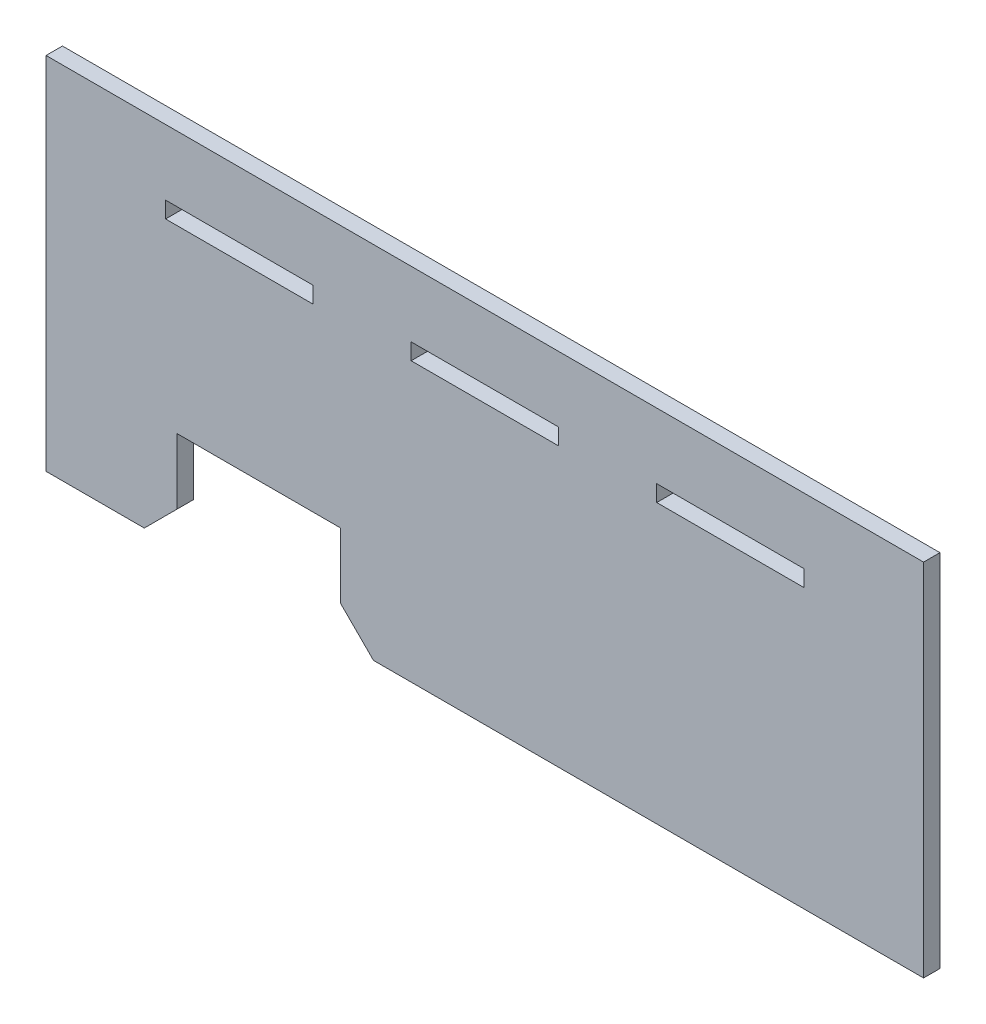
ISO-10303-21;
HEADER;
FILE_DESCRIPTION(('STEP AP214'),'2;1');
FILE_NAME('part.step','',(''),(''),'','','');
FILE_SCHEMA(('AUTOMOTIVE_DESIGN { 1 0 10303 214 1 1 1 1 }'));
ENDSEC;
DATA;
#1=APPLICATION_CONTEXT('core data for automotive mechanical design processes');
#2=APPLICATION_PROTOCOL_DEFINITION('international standard','automotive_design',2000,#1);
#3=PRODUCT_CONTEXT('',#1,'mechanical');
#4=PRODUCT('Part','Part','',(#3));
#5=PRODUCT_RELATED_PRODUCT_CATEGORY('part','',(#4));
#6=PRODUCT_DEFINITION_FORMATION('','',#4);
#7=PRODUCT_DEFINITION_CONTEXT('part definition',#1,'design');
#8=PRODUCT_DEFINITION('design','',#6,#7);
#9=PRODUCT_DEFINITION_SHAPE('','',#8);
#10=(LENGTH_UNIT() NAMED_UNIT(*) SI_UNIT(.MILLI.,.METRE.));
#11=(NAMED_UNIT(*) PLANE_ANGLE_UNIT() SI_UNIT($,.RADIAN.));
#12=(NAMED_UNIT(*) SI_UNIT($,.STERADIAN.) SOLID_ANGLE_UNIT());
#13=UNCERTAINTY_MEASURE_WITH_UNIT(LENGTH_MEASURE(1.E-05),#10,'distance_accuracy_value','');
#14=(GEOMETRIC_REPRESENTATION_CONTEXT(3) GLOBAL_UNCERTAINTY_ASSIGNED_CONTEXT((#13)) GLOBAL_UNIT_ASSIGNED_CONTEXT((#10,
#11,#12)) REPRESENTATION_CONTEXT('',''));
#15=CARTESIAN_POINT('',(0.,0.,0.));
#16=DIRECTION('',(0.,0.,1.));
#17=DIRECTION('',(1.,0.,0.));
#18=AXIS2_PLACEMENT_3D('',#15,#16,#17);
#19=CARTESIAN_POINT('',(0.,0.,10.));
#20=DIRECTION('',(0.,0.,1.));
#21=DIRECTION('',(1.,0.,0.));
#22=AXIS2_PLACEMENT_3D('',#19,#20,#21);
#23=PLANE('',#22);
#24=DIRECTION('',(0.,1.,0.));
#25=VECTOR('',#24,1.);
#26=CARTESIAN_POINT('',(313.,180.,10.));
#27=LINE('',#26,#25);
#28=CARTESIAN_POINT('',(313.,170.,10.));
#29=VERTEX_POINT('',#28);
#30=CARTESIAN_POINT('',(313.,180.,10.));
#31=VERTEX_POINT('',#30);
#32=EDGE_CURVE('E226',#29,#31,#27,.T.);
#33=ORIENTED_EDGE('',*,*,#32,.F.);
#34=DIRECTION('',(1.,0.,0.));
#35=VECTOR('',#34,1.);
#36=CARTESIAN_POINT('',(223.,170.,10.));
#37=LINE('',#36,#35);
#38=CARTESIAN_POINT('',(223.,170.,10.));
#39=VERTEX_POINT('',#38);
#40=EDGE_CURVE('E224',#39,#29,#37,.T.);
#41=ORIENTED_EDGE('',*,*,#40,.F.);
#42=DIRECTION('',(0.,-1.,0.));
#43=VECTOR('',#42,1.);
#44=CARTESIAN_POINT('',(223.,180.,10.));
#45=LINE('',#44,#43);
#46=CARTESIAN_POINT('',(223.,180.,10.));
#47=VERTEX_POINT('',#46);
#48=EDGE_CURVE('E232',#47,#39,#45,.T.);
#49=ORIENTED_EDGE('',*,*,#48,.F.);
#50=DIRECTION('',(-1.,0.,0.));
#51=VECTOR('',#50,1.);
#52=CARTESIAN_POINT('',(313.,180.,10.));
#53=LINE('',#52,#51);
#54=EDGE_CURVE('E229',#31,#47,#53,.T.);
#55=ORIENTED_EDGE('',*,*,#54,.F.);
#56=EDGE_LOOP('',(#33,#41,#49,#55));
#57=FACE_BOUND('',#56,.T.);
#58=DIRECTION('',(1.,0.,0.));
#59=VECTOR('',#58,1.);
#60=CARTESIAN_POINT('',(0.,0.,10.));
#61=LINE('',#60,#59);
#62=CARTESIAN_POINT('',(0.,0.,10.));
#63=VERTEX_POINT('',#62);
#64=CARTESIAN_POINT('',(59.9999999999999,0.,10.));
#65=VERTEX_POINT('',#64);
#66=EDGE_CURVE('E286',#63,#65,#61,.T.);
#67=ORIENTED_EDGE('',*,*,#66,.T.);
#68=DIRECTION('',(-0.707106781186549,-0.707106781186546,0.));
#69=VECTOR('',#68,1.);
#70=CARTESIAN_POINT('',(29.9999999999998,-29.9999999999999,10.));
#71=LINE('',#70,#69);
#72=CARTESIAN_POINT('',(80.,20.,10.));
#73=VERTEX_POINT('',#72);
#74=EDGE_CURVE('E347',#65,#73,#71,.F.);
#75=ORIENTED_EDGE('',*,*,#74,.T.);
#76=DIRECTION('',(0.,1.,0.));
#77=VECTOR('',#76,1.);
#78=CARTESIAN_POINT('',(80.,0.,10.));
#79=LINE('',#78,#77);
#80=CARTESIAN_POINT('',(80.,60.,10.));
#81=VERTEX_POINT('',#80);
#82=EDGE_CURVE('E289',#73,#81,#79,.T.);
#83=ORIENTED_EDGE('',*,*,#82,.T.);
#84=DIRECTION('',(1.,0.,0.));
#85=VECTOR('',#84,1.);
#86=CARTESIAN_POINT('',(80.,60.,10.));
#87=LINE('',#86,#85);
#88=CARTESIAN_POINT('',(180.,60.,10.));
#89=VERTEX_POINT('',#88);
#90=EDGE_CURVE('E292',#81,#89,#87,.T.);
#91=ORIENTED_EDGE('',*,*,#90,.T.);
#92=DIRECTION('',(0.,-1.,0.));
#93=VECTOR('',#92,1.);
#94=CARTESIAN_POINT('',(180.,60.,10.));
#95=LINE('',#94,#93);
#96=CARTESIAN_POINT('',(180.,20.0000000000001,10.));
#97=VERTEX_POINT('',#96);
#98=EDGE_CURVE('E294',#89,#97,#95,.T.);
#99=ORIENTED_EDGE('',*,*,#98,.T.);
#100=DIRECTION('',(-0.707106781186546,0.70710678118655,0.));
#101=VECTOR('',#100,1.);
#102=CARTESIAN_POINT('',(100.000000000001,100.,10.));
#103=LINE('',#102,#101);
#104=CARTESIAN_POINT('',(200.,0.,10.));
#105=VERTEX_POINT('',#104);
#106=EDGE_CURVE('E48',#97,#105,#103,.F.);
#107=ORIENTED_EDGE('',*,*,#106,.T.);
#108=DIRECTION('',(1.,0.,0.));
#109=VECTOR('',#108,1.);
#110=CARTESIAN_POINT('',(180.,0.,10.));
#111=LINE('',#110,#109);
#112=CARTESIAN_POINT('',(536.,0.,10.));
#113=VERTEX_POINT('',#112);
#114=EDGE_CURVE('E296',#105,#113,#111,.T.);
#115=ORIENTED_EDGE('',*,*,#114,.T.);
#116=DIRECTION('',(0.,1.,0.));
#117=VECTOR('',#116,1.);
#118=CARTESIAN_POINT('',(536.,0.,10.));
#119=LINE('',#118,#117);
#120=CARTESIAN_POINT('',(536.,220.,10.));
#121=VERTEX_POINT('',#120);
#122=EDGE_CURVE('E298',#113,#121,#119,.T.);
#123=ORIENTED_EDGE('',*,*,#122,.T.);
#124=DIRECTION('',(-1.,0.,0.));
#125=VECTOR('',#124,1.);
#126=CARTESIAN_POINT('',(0.,220.,10.));
#127=LINE('',#126,#125);
#128=CARTESIAN_POINT('',(0.,220.,10.));
#129=VERTEX_POINT('',#128);
#130=EDGE_CURVE('E300',#121,#129,#127,.T.);
#131=ORIENTED_EDGE('',*,*,#130,.T.);
#132=DIRECTION('',(0.,-1.,0.));
#133=VECTOR('',#132,1.);
#134=CARTESIAN_POINT('',(0.,0.,10.));
#135=LINE('',#134,#133);
#136=EDGE_CURVE('E302',#129,#63,#135,.T.);
#137=ORIENTED_EDGE('',*,*,#136,.T.);
#138=EDGE_LOOP('',(#67,#75,#83,#91,#99,#107,#115,#123,#131,#137));
#139=FACE_BOUND('',#138,.T.);
#140=DIRECTION('',(0.,-1.,0.));
#141=VECTOR('',#140,1.);
#142=CARTESIAN_POINT('',(73.,180.,10.));
#143=LINE('',#142,#141);
#144=CARTESIAN_POINT('',(73.,180.,10.));
#145=VERTEX_POINT('',#144);
#146=CARTESIAN_POINT('',(73.,170.,10.));
#147=VERTEX_POINT('',#146);
#148=EDGE_CURVE('E257',#145,#147,#143,.T.);
#149=ORIENTED_EDGE('',*,*,#148,.F.);
#150=DIRECTION('',(-1.,0.,0.));
#151=VECTOR('',#150,1.);
#152=CARTESIAN_POINT('',(163.,180.,10.));
#153=LINE('',#152,#151);
#154=CARTESIAN_POINT('',(163.,180.,10.));
#155=VERTEX_POINT('',#154);
#156=EDGE_CURVE('E255',#155,#145,#153,.T.);
#157=ORIENTED_EDGE('',*,*,#156,.F.);
#158=DIRECTION('',(0.,1.,0.));
#159=VECTOR('',#158,1.);
#160=CARTESIAN_POINT('',(163.,180.,10.));
#161=LINE('',#160,#159);
#162=CARTESIAN_POINT('',(163.,170.,10.));
#163=VERTEX_POINT('',#162);
#164=EDGE_CURVE('E263',#163,#155,#161,.T.);
#165=ORIENTED_EDGE('',*,*,#164,.F.);
#166=DIRECTION('',(1.,0.,0.));
#167=VECTOR('',#166,1.);
#168=CARTESIAN_POINT('',(163.,170.,10.));
#169=LINE('',#168,#167);
#170=EDGE_CURVE('E260',#147,#163,#169,.T.);
#171=ORIENTED_EDGE('',*,*,#170,.F.);
#172=EDGE_LOOP('',(#149,#157,#165,#171));
#173=FACE_BOUND('',#172,.T.);
#174=DIRECTION('',(0.,1.,0.));
#175=VECTOR('',#174,1.);
#176=CARTESIAN_POINT('',(463.,180.,10.));
#177=LINE('',#176,#175);
#178=CARTESIAN_POINT('',(463.,170.,10.));
#179=VERTEX_POINT('',#178);
#180=CARTESIAN_POINT('',(463.,180.,10.));
#181=VERTEX_POINT('',#180);
#182=EDGE_CURVE('E193',#179,#181,#177,.T.);
#183=ORIENTED_EDGE('',*,*,#182,.F.);
#184=DIRECTION('',(1.,0.,0.));
#185=VECTOR('',#184,1.);
#186=CARTESIAN_POINT('',(463.,170.,10.));
#187=LINE('',#186,#185);
#188=CARTESIAN_POINT('',(373.,170.,10.));
#189=VERTEX_POINT('',#188);
#190=EDGE_CURVE('E183',#189,#179,#187,.T.);
#191=ORIENTED_EDGE('',*,*,#190,.F.);
#192=DIRECTION('',(0.,-1.,0.));
#193=VECTOR('',#192,1.);
#194=CARTESIAN_POINT('',(373.,180.,10.));
#195=LINE('',#194,#193);
#196=CARTESIAN_POINT('',(373.,180.,10.));
#197=VERTEX_POINT('',#196);
#198=EDGE_CURVE('E208',#197,#189,#195,.T.);
#199=ORIENTED_EDGE('',*,*,#198,.F.);
#200=DIRECTION('',(-1.,0.,0.));
#201=VECTOR('',#200,1.);
#202=CARTESIAN_POINT('',(373.,180.,10.));
#203=LINE('',#202,#201);
#204=EDGE_CURVE('E206',#181,#197,#203,.T.);
#205=ORIENTED_EDGE('',*,*,#204,.F.);
#206=EDGE_LOOP('',(#183,#191,#199,#205));
#207=FACE_BOUND('',#206,.T.);
#208=ADVANCED_FACE('F33',(#57,#139,#173,#207),#23,.T.);
#209=CARTESIAN_POINT('',(0.,0.,0.));
#210=DIRECTION('',(0.,0.,1.));
#211=DIRECTION('',(1.,0.,0.));
#212=AXIS2_PLACEMENT_3D('',#209,#210,#211);
#213=PLANE('',#212);
#214=DIRECTION('',(1.,0.,0.));
#215=VECTOR('',#214,1.);
#216=CARTESIAN_POINT('',(223.,170.,0.));
#217=LINE('',#216,#215);
#218=CARTESIAN_POINT('',(223.,170.,0.));
#219=VERTEX_POINT('',#218);
#220=CARTESIAN_POINT('',(313.,170.,0.));
#221=VERTEX_POINT('',#220);
#222=EDGE_CURVE('E201',#219,#221,#217,.T.);
#223=ORIENTED_EDGE('',*,*,#222,.T.);
#224=DIRECTION('',(0.,1.,0.));
#225=VECTOR('',#224,1.);
#226=CARTESIAN_POINT('',(313.,180.,0.));
#227=LINE('',#226,#225);
#228=CARTESIAN_POINT('',(313.,180.,0.));
#229=VERTEX_POINT('',#228);
#230=EDGE_CURVE('E237',#221,#229,#227,.T.);
#231=ORIENTED_EDGE('',*,*,#230,.T.);
#232=DIRECTION('',(-1.,0.,0.));
#233=VECTOR('',#232,1.);
#234=CARTESIAN_POINT('',(313.,180.,0.));
#235=LINE('',#234,#233);
#236=CARTESIAN_POINT('',(223.,180.,0.));
#237=VERTEX_POINT('',#236);
#238=EDGE_CURVE('E240',#229,#237,#235,.T.);
#239=ORIENTED_EDGE('',*,*,#238,.T.);
#240=DIRECTION('',(0.,-1.,0.));
#241=VECTOR('',#240,1.);
#242=CARTESIAN_POINT('',(223.,180.,0.));
#243=LINE('',#242,#241);
#244=EDGE_CURVE('E227',#237,#219,#243,.T.);
#245=ORIENTED_EDGE('',*,*,#244,.T.);
#246=EDGE_LOOP('',(#223,#231,#239,#245));
#247=FACE_BOUND('',#246,.T.);
#248=DIRECTION('',(0.,1.,0.));
#249=VECTOR('',#248,1.);
#250=CARTESIAN_POINT('',(80.,0.,0.));
#251=LINE('',#250,#249);
#252=CARTESIAN_POINT('',(80.,20.,0.));
#253=VERTEX_POINT('',#252);
#254=CARTESIAN_POINT('',(80.,60.,0.));
#255=VERTEX_POINT('',#254);
#256=EDGE_CURVE('E307',#253,#255,#251,.T.);
#257=ORIENTED_EDGE('',*,*,#256,.F.);
#258=DIRECTION('',(0.707106781186549,0.707106781186546,0.));
#259=VECTOR('',#258,1.);
#260=CARTESIAN_POINT('',(80.,20.,0.));
#261=LINE('',#260,#259);
#262=CARTESIAN_POINT('',(59.9999999999999,0.,0.));
#263=VERTEX_POINT('',#262);
#264=EDGE_CURVE('E342',#253,#263,#261,.F.);
#265=ORIENTED_EDGE('',*,*,#264,.T.);
#266=DIRECTION('',(1.,0.,0.));
#267=VECTOR('',#266,1.);
#268=CARTESIAN_POINT('',(0.,0.,0.));
#269=LINE('',#268,#267);
#270=CARTESIAN_POINT('',(0.,0.,0.));
#271=VERTEX_POINT('',#270);
#272=EDGE_CURVE('E285',#271,#263,#269,.T.);
#273=ORIENTED_EDGE('',*,*,#272,.F.);
#274=DIRECTION('',(0.,-1.,0.));
#275=VECTOR('',#274,1.);
#276=CARTESIAN_POINT('',(0.,0.,0.));
#277=LINE('',#276,#275);
#278=CARTESIAN_POINT('',(0.,220.,0.));
#279=VERTEX_POINT('',#278);
#280=EDGE_CURVE('E290',#279,#271,#277,.T.);
#281=ORIENTED_EDGE('',*,*,#280,.F.);
#282=DIRECTION('',(-1.,0.,0.));
#283=VECTOR('',#282,1.);
#284=CARTESIAN_POINT('',(0.,220.,0.));
#285=LINE('',#284,#283);
#286=CARTESIAN_POINT('',(536.,220.,0.));
#287=VERTEX_POINT('',#286);
#288=EDGE_CURVE('E317',#287,#279,#285,.T.);
#289=ORIENTED_EDGE('',*,*,#288,.F.);
#290=DIRECTION('',(0.,1.,0.));
#291=VECTOR('',#290,1.);
#292=CARTESIAN_POINT('',(536.,0.,0.));
#293=LINE('',#292,#291);
#294=CARTESIAN_POINT('',(536.,0.,0.));
#295=VERTEX_POINT('',#294);
#296=EDGE_CURVE('E315',#295,#287,#293,.T.);
#297=ORIENTED_EDGE('',*,*,#296,.F.);
#298=DIRECTION('',(1.,0.,0.));
#299=VECTOR('',#298,1.);
#300=CARTESIAN_POINT('',(435.999999999999,0.,0.));
#301=LINE('',#300,#299);
#302=CARTESIAN_POINT('',(200.,0.,0.));
#303=VERTEX_POINT('',#302);
#304=EDGE_CURVE('E313',#303,#295,#301,.T.);
#305=ORIENTED_EDGE('',*,*,#304,.F.);
#306=DIRECTION('',(0.707106781186546,-0.70710678118655,0.));
#307=VECTOR('',#306,1.);
#308=CARTESIAN_POINT('',(200.,0.,0.));
#309=LINE('',#308,#307);
#310=CARTESIAN_POINT('',(180.,20.0000000000001,0.));
#311=VERTEX_POINT('',#310);
#312=EDGE_CURVE('E340',#303,#311,#309,.F.);
#313=ORIENTED_EDGE('',*,*,#312,.T.);
#314=DIRECTION('',(0.,-1.,0.));
#315=VECTOR('',#314,1.);
#316=CARTESIAN_POINT('',(180.,60.,0.));
#317=LINE('',#316,#315);
#318=CARTESIAN_POINT('',(180.,60.,0.));
#319=VERTEX_POINT('',#318);
#320=EDGE_CURVE('E311',#319,#311,#317,.T.);
#321=ORIENTED_EDGE('',*,*,#320,.F.);
#322=DIRECTION('',(1.,0.,0.));
#323=VECTOR('',#322,1.);
#324=CARTESIAN_POINT('',(80.,60.,0.));
#325=LINE('',#324,#323);
#326=EDGE_CURVE('E309',#255,#319,#325,.T.);
#327=ORIENTED_EDGE('',*,*,#326,.F.);
#328=EDGE_LOOP('',(#257,#265,#273,#281,#289,#297,#305,#313,#321,#327));
#329=FACE_BOUND('',#328,.T.);
#330=DIRECTION('',(-1.,0.,0.));
#331=VECTOR('',#330,1.);
#332=CARTESIAN_POINT('',(163.,180.,0.));
#333=LINE('',#332,#331);
#334=CARTESIAN_POINT('',(163.,180.,0.));
#335=VERTEX_POINT('',#334);
#336=CARTESIAN_POINT('',(73.,180.,0.));
#337=VERTEX_POINT('',#336);
#338=EDGE_CURVE('E254',#335,#337,#333,.T.);
#339=ORIENTED_EDGE('',*,*,#338,.T.);
#340=DIRECTION('',(0.,-1.,0.));
#341=VECTOR('',#340,1.);
#342=CARTESIAN_POINT('',(73.,180.,0.));
#343=LINE('',#342,#341);
#344=CARTESIAN_POINT('',(73.,170.,0.));
#345=VERTEX_POINT('',#344);
#346=EDGE_CURVE('E268',#337,#345,#343,.T.);
#347=ORIENTED_EDGE('',*,*,#346,.T.);
#348=DIRECTION('',(1.,0.,0.));
#349=VECTOR('',#348,1.);
#350=CARTESIAN_POINT('',(163.,170.,0.));
#351=LINE('',#350,#349);
#352=CARTESIAN_POINT('',(163.,170.,0.));
#353=VERTEX_POINT('',#352);
#354=EDGE_CURVE('E271',#345,#353,#351,.T.);
#355=ORIENTED_EDGE('',*,*,#354,.T.);
#356=DIRECTION('',(0.,1.,0.));
#357=VECTOR('',#356,1.);
#358=CARTESIAN_POINT('',(163.,180.,0.));
#359=LINE('',#358,#357);
#360=EDGE_CURVE('E258',#353,#335,#359,.T.);
#361=ORIENTED_EDGE('',*,*,#360,.T.);
#362=EDGE_LOOP('',(#339,#347,#355,#361));
#363=FACE_BOUND('',#362,.T.);
#364=DIRECTION('',(1.,0.,0.));
#365=VECTOR('',#364,1.);
#366=CARTESIAN_POINT('',(463.,170.,0.));
#367=LINE('',#366,#365);
#368=CARTESIAN_POINT('',(373.,170.,0.));
#369=VERTEX_POINT('',#368);
#370=CARTESIAN_POINT('',(463.,170.,0.));
#371=VERTEX_POINT('',#370);
#372=EDGE_CURVE('E212',#369,#371,#367,.T.);
#373=ORIENTED_EDGE('',*,*,#372,.T.);
#374=DIRECTION('',(0.,1.,0.));
#375=VECTOR('',#374,1.);
#376=CARTESIAN_POINT('',(463.,180.,0.));
#377=LINE('',#376,#375);
#378=CARTESIAN_POINT('',(463.,180.,0.));
#379=VERTEX_POINT('',#378);
#380=EDGE_CURVE('E200',#371,#379,#377,.T.);
#381=ORIENTED_EDGE('',*,*,#380,.T.);
#382=DIRECTION('',(-1.,0.,0.));
#383=VECTOR('',#382,1.);
#384=CARTESIAN_POINT('',(373.,180.,0.));
#385=LINE('',#384,#383);
#386=CARTESIAN_POINT('',(373.,180.,0.));
#387=VERTEX_POINT('',#386);
#388=EDGE_CURVE('E215',#379,#387,#385,.T.);
#389=ORIENTED_EDGE('',*,*,#388,.T.);
#390=DIRECTION('',(0.,-1.,0.));
#391=VECTOR('',#390,1.);
#392=CARTESIAN_POINT('',(373.,180.,0.));
#393=LINE('',#392,#391);
#394=EDGE_CURVE('E194',#387,#369,#393,.T.);
#395=ORIENTED_EDGE('',*,*,#394,.T.);
#396=EDGE_LOOP('',(#373,#381,#389,#395));
#397=FACE_BOUND('',#396,.T.);
#398=ADVANCED_FACE('F358',(#247,#329,#363,#397),#213,.F.);
#399=CARTESIAN_POINT('',(0.,0.,10.));
#400=DIRECTION('',(0.,1.,0.));
#401=DIRECTION('',(0.,0.,1.));
#402=AXIS2_PLACEMENT_3D('',#399,#400,#401);
#403=PLANE('',#402);
#404=ORIENTED_EDGE('',*,*,#272,.T.);
#405=DIRECTION('',(0.,0.,1.));
#406=VECTOR('',#405,1.);
#407=CARTESIAN_POINT('',(59.9999999999999,0.,10.));
#408=LINE('',#407,#406);
#409=EDGE_CURVE('E344',#263,#65,#408,.T.);
#410=ORIENTED_EDGE('',*,*,#409,.T.);
#411=ORIENTED_EDGE('',*,*,#66,.F.);
#412=DIRECTION('',(0.,0.,-1.));
#413=VECTOR('',#412,1.);
#414=CARTESIAN_POINT('',(0.,0.,10.));
#415=LINE('',#414,#413);
#416=EDGE_CURVE('E304',#63,#271,#415,.T.);
#417=ORIENTED_EDGE('',*,*,#416,.T.);
#418=EDGE_LOOP('',(#404,#410,#411,#417));
#419=FACE_BOUND('',#418,.T.);
#420=ADVANCED_FACE('F380',(#419),#403,.F.);
#421=CARTESIAN_POINT('',(80.,0.,10.));
#422=DIRECTION('',(-1.,0.,0.));
#423=DIRECTION('',(0.,0.,1.));
#424=AXIS2_PLACEMENT_3D('',#421,#422,#423);
#425=PLANE('',#424);
#426=ORIENTED_EDGE('',*,*,#82,.F.);
#427=DIRECTION('',(0.,0.,-1.));
#428=VECTOR('',#427,1.);
#429=CARTESIAN_POINT('',(80.,20.,10.));
#430=LINE('',#429,#428);
#431=EDGE_CURVE('E337',#73,#253,#430,.T.);
#432=ORIENTED_EDGE('',*,*,#431,.T.);
#433=ORIENTED_EDGE('',*,*,#256,.T.);
#434=DIRECTION('',(0.,0.,-1.));
#435=VECTOR('',#434,1.);
#436=CARTESIAN_POINT('',(80.,60.,10.));
#437=LINE('',#436,#435);
#438=EDGE_CURVE('E334',#81,#255,#437,.T.);
#439=ORIENTED_EDGE('',*,*,#438,.F.);
#440=EDGE_LOOP('',(#426,#432,#433,#439));
#441=FACE_BOUND('',#440,.T.);
#442=ADVANCED_FACE('F388',(#441),#425,.F.);
#443=CARTESIAN_POINT('',(80.,60.,10.));
#444=DIRECTION('',(0.,1.,0.));
#445=DIRECTION('',(0.,0.,1.));
#446=AXIS2_PLACEMENT_3D('',#443,#444,#445);
#447=PLANE('',#446);
#448=ORIENTED_EDGE('',*,*,#326,.T.);
#449=DIRECTION('',(0.,0.,-1.));
#450=VECTOR('',#449,1.);
#451=CARTESIAN_POINT('',(180.,60.,10.));
#452=LINE('',#451,#450);
#453=EDGE_CURVE('E331',#89,#319,#452,.T.);
#454=ORIENTED_EDGE('',*,*,#453,.F.);
#455=ORIENTED_EDGE('',*,*,#90,.F.);
#456=ORIENTED_EDGE('',*,*,#438,.T.);
#457=EDGE_LOOP('',(#448,#454,#455,#456));
#458=FACE_BOUND('',#457,.T.);
#459=ADVANCED_FACE('F393',(#458),#447,.F.);
#460=CARTESIAN_POINT('',(180.,60.,10.));
#461=DIRECTION('',(1.,0.,0.));
#462=DIRECTION('',(0.,0.,-1.));
#463=AXIS2_PLACEMENT_3D('',#460,#461,#462);
#464=PLANE('',#463);
#465=ORIENTED_EDGE('',*,*,#320,.T.);
#466=DIRECTION('',(0.,0.,1.));
#467=VECTOR('',#466,1.);
#468=CARTESIAN_POINT('',(180.,20.0000000000001,10.));
#469=LINE('',#468,#467);
#470=EDGE_CURVE('E11',#311,#97,#469,.T.);
#471=ORIENTED_EDGE('',*,*,#470,.T.);
#472=ORIENTED_EDGE('',*,*,#98,.F.);
#473=ORIENTED_EDGE('',*,*,#453,.T.);
#474=EDGE_LOOP('',(#465,#471,#472,#473));
#475=FACE_BOUND('',#474,.T.);
#476=ADVANCED_FACE('F420',(#475),#464,.F.);
#477=CARTESIAN_POINT('',(435.999999999999,0.,10.));
#478=DIRECTION('',(0.,1.,0.));
#479=DIRECTION('',(0.,0.,1.));
#480=AXIS2_PLACEMENT_3D('',#477,#478,#479);
#481=PLANE('',#480);
#482=ORIENTED_EDGE('',*,*,#114,.F.);
#483=DIRECTION('',(0.,0.,-1.));
#484=VECTOR('',#483,1.);
#485=CARTESIAN_POINT('',(200.,0.,10.));
#486=LINE('',#485,#484);
#487=EDGE_CURVE('E41',#105,#303,#486,.T.);
#488=ORIENTED_EDGE('',*,*,#487,.T.);
#489=ORIENTED_EDGE('',*,*,#304,.T.);
#490=DIRECTION('',(0.,0.,-1.));
#491=VECTOR('',#490,1.);
#492=CARTESIAN_POINT('',(536.,0.,10.));
#493=LINE('',#492,#491);
#494=EDGE_CURVE('E328',#113,#295,#493,.T.);
#495=ORIENTED_EDGE('',*,*,#494,.F.);
#496=EDGE_LOOP('',(#482,#488,#489,#495));
#497=FACE_BOUND('',#496,.T.);
#498=ADVANCED_FACE('F352',(#497),#481,.F.);
#499=CARTESIAN_POINT('',(536.,0.,10.));
#500=DIRECTION('',(-1.,0.,0.));
#501=DIRECTION('',(0.,0.,1.));
#502=AXIS2_PLACEMENT_3D('',#499,#500,#501);
#503=PLANE('',#502);
#504=ORIENTED_EDGE('',*,*,#296,.T.);
#505=DIRECTION('',(0.,0.,-1.));
#506=VECTOR('',#505,1.);
#507=CARTESIAN_POINT('',(536.,220.,10.));
#508=LINE('',#507,#506);
#509=EDGE_CURVE('E325',#121,#287,#508,.T.);
#510=ORIENTED_EDGE('',*,*,#509,.F.);
#511=ORIENTED_EDGE('',*,*,#122,.F.);
#512=ORIENTED_EDGE('',*,*,#494,.T.);
#513=EDGE_LOOP('',(#504,#510,#511,#512));
#514=FACE_BOUND('',#513,.T.);
#515=ADVANCED_FACE('F365',(#514),#503,.F.);
#516=CARTESIAN_POINT('',(0.,220.,10.));
#517=DIRECTION('',(0.,-1.,0.));
#518=DIRECTION('',(0.,0.,-1.));
#519=AXIS2_PLACEMENT_3D('',#516,#517,#518);
#520=PLANE('',#519);
#521=ORIENTED_EDGE('',*,*,#288,.T.);
#522=DIRECTION('',(0.,0.,-1.));
#523=VECTOR('',#522,1.);
#524=CARTESIAN_POINT('',(0.,220.,10.));
#525=LINE('',#524,#523);
#526=EDGE_CURVE('E322',#129,#279,#525,.T.);
#527=ORIENTED_EDGE('',*,*,#526,.F.);
#528=ORIENTED_EDGE('',*,*,#130,.F.);
#529=ORIENTED_EDGE('',*,*,#509,.T.);
#530=EDGE_LOOP('',(#521,#527,#528,#529));
#531=FACE_BOUND('',#530,.T.);
#532=ADVANCED_FACE('F369',(#531),#520,.F.);
#533=CARTESIAN_POINT('',(0.,0.,10.));
#534=DIRECTION('',(1.,0.,0.));
#535=DIRECTION('',(0.,0.,-1.));
#536=AXIS2_PLACEMENT_3D('',#533,#534,#535);
#537=PLANE('',#536);
#538=ORIENTED_EDGE('',*,*,#280,.T.);
#539=ORIENTED_EDGE('',*,*,#416,.F.);
#540=ORIENTED_EDGE('',*,*,#136,.F.);
#541=ORIENTED_EDGE('',*,*,#526,.T.);
#542=EDGE_LOOP('',(#538,#539,#540,#541));
#543=FACE_BOUND('',#542,.T.);
#544=ADVANCED_FACE('F377',(#543),#537,.F.);
#545=CARTESIAN_POINT('',(163.,180.,10.));
#546=DIRECTION('',(0.,-1.,0.));
#547=DIRECTION('',(0.,0.,-1.));
#548=AXIS2_PLACEMENT_3D('',#545,#546,#547);
#549=PLANE('',#548);
#550=ORIENTED_EDGE('',*,*,#338,.F.);
#551=DIRECTION('',(0.,0.,-1.));
#552=VECTOR('',#551,1.);
#553=CARTESIAN_POINT('',(163.,180.,10.));
#554=LINE('',#553,#552);
#555=EDGE_CURVE('E265',#155,#335,#554,.T.);
#556=ORIENTED_EDGE('',*,*,#555,.F.);
#557=ORIENTED_EDGE('',*,*,#156,.T.);
#558=DIRECTION('',(0.,0.,-1.));
#559=VECTOR('',#558,1.);
#560=CARTESIAN_POINT('',(73.,180.,10.));
#561=LINE('',#560,#559);
#562=EDGE_CURVE('E282',#145,#337,#561,.T.);
#563=ORIENTED_EDGE('',*,*,#562,.T.);
#564=EDGE_LOOP('',(#550,#556,#557,#563));
#565=FACE_BOUND('',#564,.T.);
#566=ADVANCED_FACE('F409',(#565),#549,.T.);
#567=CARTESIAN_POINT('',(73.,180.,10.));
#568=DIRECTION('',(1.,0.,0.));
#569=DIRECTION('',(0.,0.,-1.));
#570=AXIS2_PLACEMENT_3D('',#567,#568,#569);
#571=PLANE('',#570);
#572=ORIENTED_EDGE('',*,*,#346,.F.);
#573=ORIENTED_EDGE('',*,*,#562,.F.);
#574=ORIENTED_EDGE('',*,*,#148,.T.);
#575=DIRECTION('',(0.,0.,-1.));
#576=VECTOR('',#575,1.);
#577=CARTESIAN_POINT('',(73.,170.,10.));
#578=LINE('',#577,#576);
#579=EDGE_CURVE('E280',#147,#345,#578,.T.);
#580=ORIENTED_EDGE('',*,*,#579,.T.);
#581=EDGE_LOOP('',(#572,#573,#574,#580));
#582=FACE_BOUND('',#581,.T.);
#583=ADVANCED_FACE('F467',(#582),#571,.T.);
#584=CARTESIAN_POINT('',(163.,170.,10.));
#585=DIRECTION('',(0.,1.,0.));
#586=DIRECTION('',(0.,0.,1.));
#587=AXIS2_PLACEMENT_3D('',#584,#585,#586);
#588=PLANE('',#587);
#589=ORIENTED_EDGE('',*,*,#354,.F.);
#590=ORIENTED_EDGE('',*,*,#579,.F.);
#591=ORIENTED_EDGE('',*,*,#170,.T.);
#592=DIRECTION('',(0.,0.,-1.));
#593=VECTOR('',#592,1.);
#594=CARTESIAN_POINT('',(163.,170.,10.));
#595=LINE('',#594,#593);
#596=EDGE_CURVE('E278',#163,#353,#595,.T.);
#597=ORIENTED_EDGE('',*,*,#596,.T.);
#598=EDGE_LOOP('',(#589,#590,#591,#597));
#599=FACE_BOUND('',#598,.T.);
#600=ADVANCED_FACE('F474',(#599),#588,.T.);
#601=CARTESIAN_POINT('',(163.,180.,10.));
#602=DIRECTION('',(-1.,0.,0.));
#603=DIRECTION('',(0.,0.,1.));
#604=AXIS2_PLACEMENT_3D('',#601,#602,#603);
#605=PLANE('',#604);
#606=ORIENTED_EDGE('',*,*,#360,.F.);
#607=ORIENTED_EDGE('',*,*,#596,.F.);
#608=ORIENTED_EDGE('',*,*,#164,.T.);
#609=ORIENTED_EDGE('',*,*,#555,.T.);
#610=EDGE_LOOP('',(#606,#607,#608,#609));
#611=FACE_BOUND('',#610,.T.);
#612=ADVANCED_FACE('F481',(#611),#605,.T.);
#613=CARTESIAN_POINT('',(223.,170.,10.));
#614=DIRECTION('',(0.,1.,0.));
#615=DIRECTION('',(0.,0.,1.));
#616=AXIS2_PLACEMENT_3D('',#613,#614,#615);
#617=PLANE('',#616);
#618=ORIENTED_EDGE('',*,*,#222,.F.);
#619=DIRECTION('',(0.,0.,-1.));
#620=VECTOR('',#619,1.);
#621=CARTESIAN_POINT('',(223.,170.,10.));
#622=LINE('',#621,#620);
#623=EDGE_CURVE('E234',#39,#219,#622,.T.);
#624=ORIENTED_EDGE('',*,*,#623,.F.);
#625=ORIENTED_EDGE('',*,*,#40,.T.);
#626=DIRECTION('',(0.,0.,-1.));
#627=VECTOR('',#626,1.);
#628=CARTESIAN_POINT('',(313.,170.,10.));
#629=LINE('',#628,#627);
#630=EDGE_CURVE('E251',#29,#221,#629,.T.);
#631=ORIENTED_EDGE('',*,*,#630,.T.);
#632=EDGE_LOOP('',(#618,#624,#625,#631));
#633=FACE_BOUND('',#632,.T.);
#634=ADVANCED_FACE('F489',(#633),#617,.T.);
#635=CARTESIAN_POINT('',(313.,180.,10.));
#636=DIRECTION('',(-1.,0.,0.));
#637=DIRECTION('',(0.,0.,1.));
#638=AXIS2_PLACEMENT_3D('',#635,#636,#637);
#639=PLANE('',#638);
#640=ORIENTED_EDGE('',*,*,#230,.F.);
#641=ORIENTED_EDGE('',*,*,#630,.F.);
#642=ORIENTED_EDGE('',*,*,#32,.T.);
#643=DIRECTION('',(0.,0.,-1.));
#644=VECTOR('',#643,1.);
#645=CARTESIAN_POINT('',(313.,180.,10.));
#646=LINE('',#645,#644);
#647=EDGE_CURVE('E249',#31,#229,#646,.T.);
#648=ORIENTED_EDGE('',*,*,#647,.T.);
#649=EDGE_LOOP('',(#640,#641,#642,#648));
#650=FACE_BOUND('',#649,.T.);
#651=ADVANCED_FACE('F497',(#650),#639,.T.);
#652=CARTESIAN_POINT('',(313.,180.,10.));
#653=DIRECTION('',(0.,-1.,0.));
#654=DIRECTION('',(0.,0.,-1.));
#655=AXIS2_PLACEMENT_3D('',#652,#653,#654);
#656=PLANE('',#655);
#657=ORIENTED_EDGE('',*,*,#238,.F.);
#658=ORIENTED_EDGE('',*,*,#647,.F.);
#659=ORIENTED_EDGE('',*,*,#54,.T.);
#660=DIRECTION('',(0.,0.,-1.));
#661=VECTOR('',#660,1.);
#662=CARTESIAN_POINT('',(223.,180.,10.));
#663=LINE('',#662,#661);
#664=EDGE_CURVE('E247',#47,#237,#663,.T.);
#665=ORIENTED_EDGE('',*,*,#664,.T.);
#666=EDGE_LOOP('',(#657,#658,#659,#665));
#667=FACE_BOUND('',#666,.T.);
#668=ADVANCED_FACE('F505',(#667),#656,.T.);
#669=CARTESIAN_POINT('',(223.,180.,10.));
#670=DIRECTION('',(1.,0.,0.));
#671=DIRECTION('',(0.,0.,-1.));
#672=AXIS2_PLACEMENT_3D('',#669,#670,#671);
#673=PLANE('',#672);
#674=ORIENTED_EDGE('',*,*,#244,.F.);
#675=ORIENTED_EDGE('',*,*,#664,.F.);
#676=ORIENTED_EDGE('',*,*,#48,.T.);
#677=ORIENTED_EDGE('',*,*,#623,.T.);
#678=EDGE_LOOP('',(#674,#675,#676,#677));
#679=FACE_BOUND('',#678,.T.);
#680=ADVANCED_FACE('F513',(#679),#673,.T.);
#681=CARTESIAN_POINT('',(463.,170.,10.));
#682=DIRECTION('',(0.,1.,0.));
#683=DIRECTION('',(0.,0.,1.));
#684=AXIS2_PLACEMENT_3D('',#681,#682,#683);
#685=PLANE('',#684);
#686=ORIENTED_EDGE('',*,*,#372,.F.);
#687=DIRECTION('',(0.,0.,-1.));
#688=VECTOR('',#687,1.);
#689=CARTESIAN_POINT('',(373.,170.,10.));
#690=LINE('',#689,#688);
#691=EDGE_CURVE('E189',#189,#369,#690,.T.);
#692=ORIENTED_EDGE('',*,*,#691,.F.);
#693=ORIENTED_EDGE('',*,*,#190,.T.);
#694=DIRECTION('',(0.,0.,-1.));
#695=VECTOR('',#694,1.);
#696=CARTESIAN_POINT('',(463.,170.,10.));
#697=LINE('',#696,#695);
#698=EDGE_CURVE('E186',#179,#371,#697,.T.);
#699=ORIENTED_EDGE('',*,*,#698,.T.);
#700=EDGE_LOOP('',(#686,#692,#693,#699));
#701=FACE_BOUND('',#700,.T.);
#702=ADVANCED_FACE('F185',(#701),#685,.T.);
#703=CARTESIAN_POINT('',(463.,180.,10.));
#704=DIRECTION('',(-1.,0.,0.));
#705=DIRECTION('',(0.,0.,1.));
#706=AXIS2_PLACEMENT_3D('',#703,#704,#705);
#707=PLANE('',#706);
#708=ORIENTED_EDGE('',*,*,#380,.F.);
#709=ORIENTED_EDGE('',*,*,#698,.F.);
#710=ORIENTED_EDGE('',*,*,#182,.T.);
#711=DIRECTION('',(0.,0.,-1.));
#712=VECTOR('',#711,1.);
#713=CARTESIAN_POINT('',(463.,180.,10.));
#714=LINE('',#713,#712);
#715=EDGE_CURVE('E202',#181,#379,#714,.T.);
#716=ORIENTED_EDGE('',*,*,#715,.T.);
#717=EDGE_LOOP('',(#708,#709,#710,#716));
#718=FACE_BOUND('',#717,.T.);
#719=ADVANCED_FACE('F197',(#718),#707,.T.);
#720=CARTESIAN_POINT('',(373.,180.,10.));
#721=DIRECTION('',(0.,-1.,0.));
#722=DIRECTION('',(0.,0.,-1.));
#723=AXIS2_PLACEMENT_3D('',#720,#721,#722);
#724=PLANE('',#723);
#725=ORIENTED_EDGE('',*,*,#388,.F.);
#726=ORIENTED_EDGE('',*,*,#715,.F.);
#727=ORIENTED_EDGE('',*,*,#204,.T.);
#728=DIRECTION('',(0.,0.,-1.));
#729=VECTOR('',#728,1.);
#730=CARTESIAN_POINT('',(373.,180.,10.));
#731=LINE('',#730,#729);
#732=EDGE_CURVE('E221',#197,#387,#731,.T.);
#733=ORIENTED_EDGE('',*,*,#732,.T.);
#734=EDGE_LOOP('',(#725,#726,#727,#733));
#735=FACE_BOUND('',#734,.T.);
#736=ADVANCED_FACE('F534',(#735),#724,.T.);
#737=CARTESIAN_POINT('',(373.,180.,10.));
#738=DIRECTION('',(1.,0.,0.));
#739=DIRECTION('',(0.,0.,-1.));
#740=AXIS2_PLACEMENT_3D('',#737,#738,#739);
#741=PLANE('',#740);
#742=ORIENTED_EDGE('',*,*,#394,.F.);
#743=ORIENTED_EDGE('',*,*,#732,.F.);
#744=ORIENTED_EDGE('',*,*,#198,.T.);
#745=ORIENTED_EDGE('',*,*,#691,.T.);
#746=EDGE_LOOP('',(#742,#743,#744,#745));
#747=FACE_BOUND('',#746,.T.);
#748=ADVANCED_FACE('F398',(#747),#741,.T.);
#749=CARTESIAN_POINT('',(80.,20.,10.));
#750=DIRECTION('',(-0.707106781186545,0.707106781186549,0.));
#751=DIRECTION('',(0.,0.,-1.));
#752=AXIS2_PLACEMENT_3D('',#749,#750,#751);
#753=PLANE('',#752);
#754=ORIENTED_EDGE('',*,*,#74,.F.);
#755=ORIENTED_EDGE('',*,*,#409,.F.);
#756=ORIENTED_EDGE('',*,*,#264,.F.);
#757=ORIENTED_EDGE('',*,*,#431,.F.);
#758=EDGE_LOOP('',(#754,#755,#756,#757));
#759=FACE_BOUND('',#758,.T.);
#760=ADVANCED_FACE('F383',(#759),#753,.F.);
#761=CARTESIAN_POINT('',(200.,0.,10.));
#762=DIRECTION('',(0.707106781186549,0.707106781186545,0.));
#763=DIRECTION('',(0.,0.,-1.));
#764=AXIS2_PLACEMENT_3D('',#761,#762,#763);
#765=PLANE('',#764);
#766=ORIENTED_EDGE('',*,*,#106,.F.);
#767=ORIENTED_EDGE('',*,*,#470,.F.);
#768=ORIENTED_EDGE('',*,*,#312,.F.);
#769=ORIENTED_EDGE('',*,*,#487,.F.);
#770=EDGE_LOOP('',(#766,#767,#768,#769));
#771=FACE_BOUND('',#770,.T.);
#772=ADVANCED_FACE('F35',(#771),#765,.F.);
#773=CLOSED_SHELL('',(#208,#398,#420,#442,#459,#476,#498,#515,#532,#544,#566,#583,#600,#612,
#634,#651,#668,#680,#702,#719,#736,#748,#760,#772));
#774=MANIFOLD_SOLID_BREP('B2',#773);
#775=ADVANCED_BREP_SHAPE_REPRESENTATION('',(#18,#774),#14);
#776=SHAPE_DEFINITION_REPRESENTATION(#9,#775);
ENDSEC;
END-ISO-10303-21;
